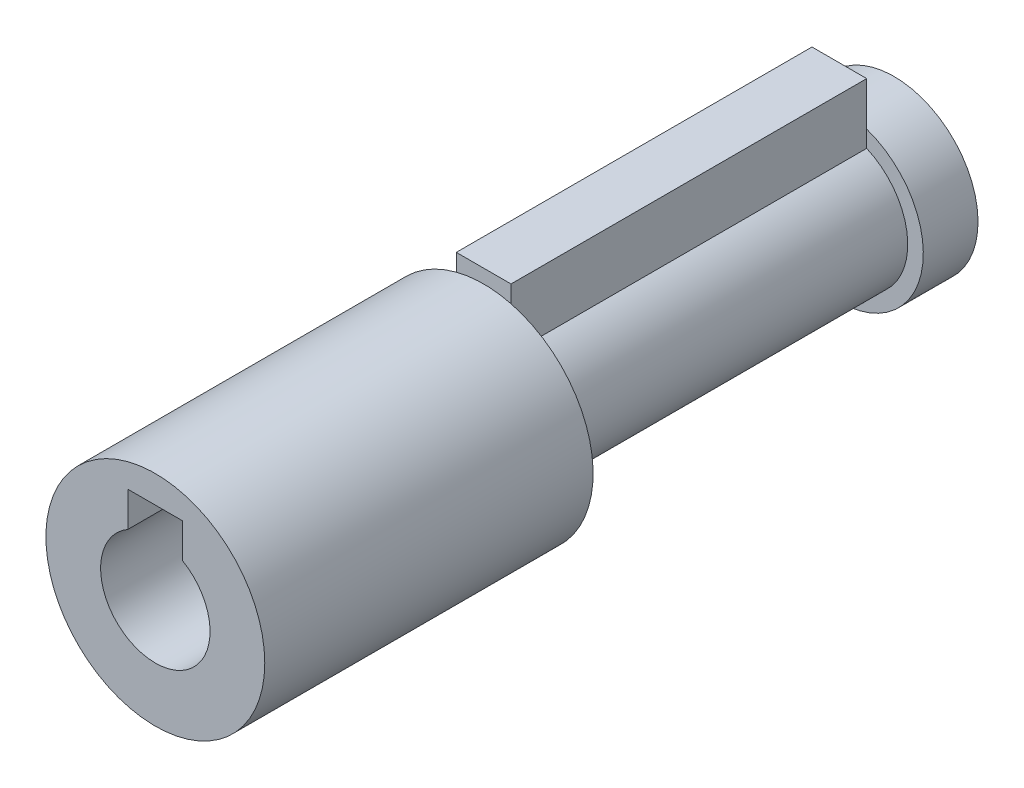
ISO-10303-21;
HEADER;
FILE_DESCRIPTION(('STEP AP214'),'2;1');
FILE_NAME('part.step','',(''),(''),'','','');
FILE_SCHEMA(('AUTOMOTIVE_DESIGN { 1 0 10303 214 1 1 1 1 }'));
ENDSEC;
DATA;
#1=APPLICATION_CONTEXT('core data for automotive mechanical design processes');
#2=APPLICATION_PROTOCOL_DEFINITION('international standard','automotive_design',2000,#1);
#3=PRODUCT_CONTEXT('',#1,'mechanical');
#4=PRODUCT('Part','Part','',(#3));
#5=PRODUCT_RELATED_PRODUCT_CATEGORY('part','',(#4));
#6=PRODUCT_DEFINITION_FORMATION('','',#4);
#7=PRODUCT_DEFINITION_CONTEXT('part definition',#1,'design');
#8=PRODUCT_DEFINITION('design','',#6,#7);
#9=PRODUCT_DEFINITION_SHAPE('','',#8);
#10=(LENGTH_UNIT() NAMED_UNIT(*) SI_UNIT(.MILLI.,.METRE.));
#11=(NAMED_UNIT(*) PLANE_ANGLE_UNIT() SI_UNIT($,.RADIAN.));
#12=(NAMED_UNIT(*) SI_UNIT($,.STERADIAN.) SOLID_ANGLE_UNIT());
#13=UNCERTAINTY_MEASURE_WITH_UNIT(LENGTH_MEASURE(1.E-05),#10,'distance_accuracy_value','');
#14=(GEOMETRIC_REPRESENTATION_CONTEXT(3) GLOBAL_UNCERTAINTY_ASSIGNED_CONTEXT((#13)) GLOBAL_UNIT_ASSIGNED_CONTEXT((#10,
#11,#12)) REPRESENTATION_CONTEXT('',''));
#15=CARTESIAN_POINT('',(0.,0.,0.));
#16=DIRECTION('',(0.,0.,1.));
#17=DIRECTION('',(1.,0.,0.));
#18=AXIS2_PLACEMENT_3D('',#15,#16,#17);
#19=CARTESIAN_POINT('',(0.,0.,12.7));
#20=DIRECTION('',(0.,0.,-1.));
#21=DIRECTION('',(-1.,0.,0.));
#22=AXIS2_PLACEMENT_3D('',#19,#20,#21);
#23=CYLINDRICAL_SURFACE('',#22,2.54);
#24=CARTESIAN_POINT('',(0.,0.,0.));
#25=DIRECTION('',(0.,0.,1.));
#26=DIRECTION('',(1.,0.,0.));
#27=AXIS2_PLACEMENT_3D('',#24,#25,#26);
#28=CIRCLE('',#27,2.54);
#29=CARTESIAN_POINT('',(-1.27,2.19970452561247,0.));
#30=VERTEX_POINT('',#29);
#31=CARTESIAN_POINT('',(1.27,2.19970452561247,0.));
#32=VERTEX_POINT('',#31);
#33=EDGE_CURVE('E181',#30,#32,#28,.T.);
#34=ORIENTED_EDGE('',*,*,#33,.F.);
#35=DIRECTION('',(0.,0.,-1.));
#36=VECTOR('',#35,1.);
#37=CARTESIAN_POINT('',(-1.27,2.19970452561247,12.7));
#38=LINE('',#37,#36);
#39=CARTESIAN_POINT('',(-1.27,2.19970452561247,12.7));
#40=VERTEX_POINT('',#39);
#41=EDGE_CURVE('E52',#40,#30,#38,.T.);
#42=ORIENTED_EDGE('',*,*,#41,.F.);
#43=CARTESIAN_POINT('',(0.,0.,12.7));
#44=DIRECTION('',(0.,0.,1.));
#45=DIRECTION('',(1.,0.,0.));
#46=AXIS2_PLACEMENT_3D('',#43,#44,#45);
#47=CIRCLE('',#46,2.54);
#48=CARTESIAN_POINT('',(1.27,2.19970452561247,12.7));
#49=VERTEX_POINT('',#48);
#50=EDGE_CURVE('E182',#40,#49,#47,.T.);
#51=ORIENTED_EDGE('',*,*,#50,.T.);
#52=DIRECTION('',(0.,0.,-1.));
#53=VECTOR('',#52,1.);
#54=CARTESIAN_POINT('',(1.27,2.19970452561247,12.7));
#55=LINE('',#54,#53);
#56=EDGE_CURVE('E196',#49,#32,#55,.T.);
#57=ORIENTED_EDGE('',*,*,#56,.T.);
#58=EDGE_LOOP('',(#34,#42,#51,#57));
#59=FACE_BOUND('',#58,.T.);
#60=ADVANCED_FACE('F49',(#59),#23,.F.);
#61=CARTESIAN_POINT('',(-1.27,0.,12.7));
#62=DIRECTION('',(1.,0.,0.));
#63=DIRECTION('',(0.,0.,-1.));
#64=AXIS2_PLACEMENT_3D('',#61,#62,#63);
#65=PLANE('',#64);
#66=DIRECTION('',(0.,-1.,0.));
#67=VECTOR('',#66,1.);
#68=CARTESIAN_POINT('',(-1.27,0.,0.));
#69=LINE('',#68,#67);
#70=CARTESIAN_POINT('',(-1.27,3.81,0.));
#71=VERTEX_POINT('',#70);
#72=EDGE_CURVE('E199',#71,#30,#69,.T.);
#73=ORIENTED_EDGE('',*,*,#72,.F.);
#74=DIRECTION('',(0.,0.,-1.));
#75=VECTOR('',#74,1.);
#76=CARTESIAN_POINT('',(-1.27,3.81,12.7));
#77=LINE('',#76,#75);
#78=CARTESIAN_POINT('',(-1.27,3.81,12.7));
#79=VERTEX_POINT('',#78);
#80=EDGE_CURVE('E209',#79,#71,#77,.T.);
#81=ORIENTED_EDGE('',*,*,#80,.F.);
#82=DIRECTION('',(0.,-1.,0.));
#83=VECTOR('',#82,1.);
#84=CARTESIAN_POINT('',(-1.27,0.,12.7));
#85=LINE('',#84,#83);
#86=EDGE_CURVE('E185',#79,#40,#85,.T.);
#87=ORIENTED_EDGE('',*,*,#86,.T.);
#88=ORIENTED_EDGE('',*,*,#41,.T.);
#89=EDGE_LOOP('',(#73,#81,#87,#88));
#90=FACE_BOUND('',#89,.T.);
#91=ADVANCED_FACE('F215',(#90),#65,.T.);
#92=CARTESIAN_POINT('',(0.,3.81,12.7));
#93=DIRECTION('',(0.,1.,0.));
#94=DIRECTION('',(-1.,0.,0.));
#95=AXIS2_PLACEMENT_3D('',#92,#93,#94);
#96=PLANE('',#95);
#97=DIRECTION('',(1.,0.,0.));
#98=VECTOR('',#97,1.);
#99=CARTESIAN_POINT('',(0.,3.81,0.));
#100=LINE('',#99,#98);
#101=CARTESIAN_POINT('',(1.27,3.81,0.));
#102=VERTEX_POINT('',#101);
#103=EDGE_CURVE('E202',#71,#102,#100,.T.);
#104=ORIENTED_EDGE('',*,*,#103,.T.);
#105=DIRECTION('',(0.,0.,-1.));
#106=VECTOR('',#105,1.);
#107=CARTESIAN_POINT('',(1.27,3.81,12.7));
#108=LINE('',#107,#106);
#109=CARTESIAN_POINT('',(1.27,3.81,12.7));
#110=VERTEX_POINT('',#109);
#111=EDGE_CURVE('E207',#110,#102,#108,.T.);
#112=ORIENTED_EDGE('',*,*,#111,.F.);
#113=DIRECTION('',(1.,0.,0.));
#114=VECTOR('',#113,1.);
#115=CARTESIAN_POINT('',(0.,3.81,12.7));
#116=LINE('',#115,#114);
#117=EDGE_CURVE('E189',#79,#110,#116,.T.);
#118=ORIENTED_EDGE('',*,*,#117,.F.);
#119=ORIENTED_EDGE('',*,*,#80,.T.);
#120=EDGE_LOOP('',(#104,#112,#118,#119));
#121=FACE_BOUND('',#120,.T.);
#122=ADVANCED_FACE('F224',(#121),#96,.F.);
#123=CARTESIAN_POINT('',(1.27,0.,12.7));
#124=DIRECTION('',(1.,0.,0.));
#125=DIRECTION('',(0.,1.,0.));
#126=AXIS2_PLACEMENT_3D('',#123,#124,#125);
#127=PLANE('',#126);
#128=DIRECTION('',(0.,-1.,0.));
#129=VECTOR('',#128,1.);
#130=CARTESIAN_POINT('',(1.27,0.,0.));
#131=LINE('',#130,#129);
#132=EDGE_CURVE('E186',#102,#32,#131,.T.);
#133=ORIENTED_EDGE('',*,*,#132,.T.);
#134=ORIENTED_EDGE('',*,*,#56,.F.);
#135=DIRECTION('',(0.,-1.,0.));
#136=VECTOR('',#135,1.);
#137=CARTESIAN_POINT('',(1.27,0.,12.7));
#138=LINE('',#137,#136);
#139=EDGE_CURVE('E191',#110,#49,#138,.T.);
#140=ORIENTED_EDGE('',*,*,#139,.F.);
#141=ORIENTED_EDGE('',*,*,#111,.T.);
#142=EDGE_LOOP('',(#133,#134,#140,#141));
#143=FACE_BOUND('',#142,.T.);
#144=ADVANCED_FACE('F227',(#143),#127,.F.);
#145=CARTESIAN_POINT('',(0.,0.,12.7));
#146=DIRECTION('',(0.,0.,-1.));
#147=DIRECTION('',(-1.,0.,0.));
#148=AXIS2_PLACEMENT_3D('',#145,#146,#147);
#149=CYLINDRICAL_SURFACE('',#148,5.08);
#150=CARTESIAN_POINT('',(0.,0.,12.7));
#151=DIRECTION('',(0.,0.,1.));
#152=DIRECTION('',(1.,0.,0.));
#153=AXIS2_PLACEMENT_3D('',#150,#151,#152);
#154=CIRCLE('',#153,5.08);
#155=CARTESIAN_POINT('',(5.08,0.,12.7));
#156=VERTEX_POINT('',#155);
#157=EDGE_CURVE('E193',#156,#156,#154,.T.);
#158=ORIENTED_EDGE('',*,*,#157,.F.);
#159=EDGE_LOOP('',(#158));
#160=FACE_BOUND('',#159,.T.);
#161=CARTESIAN_POINT('',(0.,0.,-2.54));
#162=DIRECTION('',(0.,0.,-1.));
#163=DIRECTION('',(-1.,0.,0.));
#164=AXIS2_PLACEMENT_3D('',#161,#162,#163);
#165=CIRCLE('',#164,5.08);
#166=CARTESIAN_POINT('',(-1.27,4.91868884968342,-2.54));
#167=VERTEX_POINT('',#166);
#168=CARTESIAN_POINT('',(1.27,4.91868884968342,-2.54));
#169=VERTEX_POINT('',#168);
#170=EDGE_CURVE('E178',#167,#169,#165,.T.);
#171=ORIENTED_EDGE('',*,*,#170,.F.);
#172=EDGE_CURVE('E177',#169,#167,#165,.T.);
#173=ORIENTED_EDGE('',*,*,#172,.F.);
#174=EDGE_LOOP('',(#171,#173));
#175=FACE_BOUND('',#174,.T.);
#176=ADVANCED_FACE('F244',(#160,#175),#149,.T.);
#177=CARTESIAN_POINT('',(0.,0.,12.7));
#178=DIRECTION('',(0.,0.,1.));
#179=DIRECTION('',(1.,0.,0.));
#180=AXIS2_PLACEMENT_3D('',#177,#178,#179);
#181=PLANE('',#180);
#182=ORIENTED_EDGE('',*,*,#50,.F.);
#183=ORIENTED_EDGE('',*,*,#86,.F.);
#184=ORIENTED_EDGE('',*,*,#117,.T.);
#185=ORIENTED_EDGE('',*,*,#139,.T.);
#186=EDGE_LOOP('',(#182,#183,#184,#185));
#187=FACE_BOUND('',#186,.T.);
#188=ORIENTED_EDGE('',*,*,#157,.T.);
#189=EDGE_LOOP('',(#188));
#190=FACE_BOUND('',#189,.T.);
#191=ADVANCED_FACE('F230',(#187,#190),#181,.T.);
#192=CARTESIAN_POINT('',(0.,0.,0.));
#193=DIRECTION('',(0.,0.,-1.));
#194=DIRECTION('',(-1.,0.,0.));
#195=AXIS2_PLACEMENT_3D('',#192,#193,#194);
#196=PLANE('',#195);
#197=ORIENTED_EDGE('',*,*,#72,.T.);
#198=ORIENTED_EDGE('',*,*,#33,.T.);
#199=ORIENTED_EDGE('',*,*,#132,.F.);
#200=ORIENTED_EDGE('',*,*,#103,.F.);
#201=EDGE_LOOP('',(#197,#198,#199,#200));
#202=FACE_BOUND('',#201,.T.);
#203=ADVANCED_FACE('F221',(#202),#196,.F.);
#204=CARTESIAN_POINT('',(0.,0.,-2.54));
#205=DIRECTION('',(0.,0.,-1.));
#206=DIRECTION('',(-1.,0.,0.));
#207=AXIS2_PLACEMENT_3D('',#204,#205,#206);
#208=PLANE('',#207);
#209=DIRECTION('',(0.,-1.,0.));
#210=VECTOR('',#209,1.);
#211=CARTESIAN_POINT('',(1.27,5.715,-2.54));
#212=LINE('',#211,#210);
#213=CARTESIAN_POINT('',(1.27,2.90993556629696,-2.54));
#214=VERTEX_POINT('',#213);
#215=EDGE_CURVE('E11',#169,#214,#212,.T.);
#216=ORIENTED_EDGE('',*,*,#215,.F.);
#217=ORIENTED_EDGE('',*,*,#172,.T.);
#218=DIRECTION('',(0.,1.,0.));
#219=VECTOR('',#218,1.);
#220=CARTESIAN_POINT('',(-1.27,5.715,-2.54));
#221=LINE('',#220,#219);
#222=CARTESIAN_POINT('',(-1.27,2.90993556629696,-2.54));
#223=VERTEX_POINT('',#222);
#224=EDGE_CURVE('E165',#223,#167,#221,.T.);
#225=ORIENTED_EDGE('',*,*,#224,.F.);
#226=CARTESIAN_POINT('',(0.,0.,-2.54));
#227=DIRECTION('',(0.,0.,-1.));
#228=DIRECTION('',(-1.,0.,0.));
#229=AXIS2_PLACEMENT_3D('',#226,#227,#228);
#230=CIRCLE('',#229,3.175);
#231=EDGE_CURVE('E73',#214,#223,#230,.T.);
#232=ORIENTED_EDGE('',*,*,#231,.F.);
#233=EDGE_LOOP('',(#216,#217,#225,#232));
#234=FACE_BOUND('',#233,.T.);
#235=ADVANCED_FACE('F251',(#234),#208,.T.);
#236=CARTESIAN_POINT('',(0.,0.,-2.54));
#237=DIRECTION('',(0.,0.,-1.));
#238=DIRECTION('',(-1.,0.,0.));
#239=AXIS2_PLACEMENT_3D('',#236,#237,#238);
#240=PLANE('',#239);
#241=CARTESIAN_POINT('',(-1.27,5.715,-2.54));
#242=VERTEX_POINT('',#241);
#243=EDGE_CURVE('E164',#167,#242,#221,.T.);
#244=ORIENTED_EDGE('',*,*,#243,.F.);
#245=ORIENTED_EDGE('',*,*,#170,.T.);
#246=CARTESIAN_POINT('',(1.27,5.715,-2.54));
#247=VERTEX_POINT('',#246);
#248=EDGE_CURVE('E58',#247,#169,#212,.T.);
#249=ORIENTED_EDGE('',*,*,#248,.F.);
#250=DIRECTION('',(1.,0.,0.));
#251=VECTOR('',#250,1.);
#252=CARTESIAN_POINT('',(1.27,5.715,-2.54));
#253=LINE('',#252,#251);
#254=EDGE_CURVE('E144',#242,#247,#253,.T.);
#255=ORIENTED_EDGE('',*,*,#254,.F.);
#256=EDGE_LOOP('',(#244,#245,#249,#255));
#257=FACE_BOUND('',#256,.T.);
#258=ADVANCED_FACE('F254',(#257),#240,.F.);
#259=CARTESIAN_POINT('',(1.27,5.715,-19.05));
#260=DIRECTION('',(-1.,0.,0.));
#261=DIRECTION('',(0.,-1.,0.));
#262=AXIS2_PLACEMENT_3D('',#259,#260,#261);
#263=PLANE('',#262);
#264=ORIENTED_EDGE('',*,*,#248,.T.);
#265=ORIENTED_EDGE('',*,*,#215,.T.);
#266=DIRECTION('',(0.,0.,1.));
#267=VECTOR('',#266,1.);
#268=CARTESIAN_POINT('',(1.27,2.90993556629696,-19.05));
#269=LINE('',#268,#267);
#270=CARTESIAN_POINT('',(1.27,2.90993556629696,-19.05));
#271=VERTEX_POINT('',#270);
#272=EDGE_CURVE('E141',#271,#214,#269,.T.);
#273=ORIENTED_EDGE('',*,*,#272,.F.);
#274=DIRECTION('',(0.,-1.,0.));
#275=VECTOR('',#274,1.);
#276=CARTESIAN_POINT('',(1.27,5.715,-19.05));
#277=LINE('',#276,#275);
#278=CARTESIAN_POINT('',(1.27,3.68440227894967,-19.05));
#279=VERTEX_POINT('',#278);
#280=EDGE_CURVE('E133',#279,#271,#277,.T.);
#281=ORIENTED_EDGE('',*,*,#280,.F.);
#282=CARTESIAN_POINT('',(1.27,5.715,-19.05));
#283=VERTEX_POINT('',#282);
#284=EDGE_CURVE('E124',#283,#279,#277,.T.);
#285=ORIENTED_EDGE('',*,*,#284,.F.);
#286=DIRECTION('',(0.,0.,1.));
#287=VECTOR('',#286,1.);
#288=CARTESIAN_POINT('',(1.27,5.715,-19.05));
#289=LINE('',#288,#287);
#290=EDGE_CURVE('E161',#283,#247,#289,.T.);
#291=ORIENTED_EDGE('',*,*,#290,.T.);
#292=EDGE_LOOP('',(#264,#265,#273,#281,#285,#291));
#293=FACE_BOUND('',#292,.T.);
#294=ADVANCED_FACE('F139',(#293),#263,.F.);
#295=CARTESIAN_POINT('',(0.,0.,-19.05));
#296=DIRECTION('',(0.,0.,1.));
#297=DIRECTION('',(1.,0.,0.));
#298=AXIS2_PLACEMENT_3D('',#295,#296,#297);
#299=CYLINDRICAL_SURFACE('',#298,3.175);
#300=ORIENTED_EDGE('',*,*,#231,.T.);
#301=DIRECTION('',(0.,0.,1.));
#302=VECTOR('',#301,1.);
#303=CARTESIAN_POINT('',(-1.27,2.90993556629696,-19.05));
#304=LINE('',#303,#302);
#305=CARTESIAN_POINT('',(-1.27,2.90993556629696,-19.05));
#306=VERTEX_POINT('',#305);
#307=EDGE_CURVE('E173',#306,#223,#304,.T.);
#308=ORIENTED_EDGE('',*,*,#307,.F.);
#309=CARTESIAN_POINT('',(0.,0.,-19.05));
#310=DIRECTION('',(0.,0.,-1.));
#311=DIRECTION('',(-1.,0.,0.));
#312=AXIS2_PLACEMENT_3D('',#309,#310,#311);
#313=CIRCLE('',#312,3.175);
#314=EDGE_CURVE('E132',#271,#306,#313,.T.);
#315=ORIENTED_EDGE('',*,*,#314,.F.);
#316=ORIENTED_EDGE('',*,*,#272,.T.);
#317=EDGE_LOOP('',(#300,#308,#315,#316));
#318=FACE_BOUND('',#317,.T.);
#319=ADVANCED_FACE('F257',(#318),#299,.T.);
#320=CARTESIAN_POINT('',(-1.27,5.715,-19.05));
#321=DIRECTION('',(1.,0.,0.));
#322=DIRECTION('',(0.,1.,0.));
#323=AXIS2_PLACEMENT_3D('',#320,#321,#322);
#324=PLANE('',#323);
#325=ORIENTED_EDGE('',*,*,#224,.T.);
#326=ORIENTED_EDGE('',*,*,#243,.T.);
#327=DIRECTION('',(0.,0.,1.));
#328=VECTOR('',#327,1.);
#329=CARTESIAN_POINT('',(-1.27,5.715,-19.05));
#330=LINE('',#329,#328);
#331=CARTESIAN_POINT('',(-1.27,5.715,-19.05));
#332=VERTEX_POINT('',#331);
#333=EDGE_CURVE('E170',#332,#242,#330,.T.);
#334=ORIENTED_EDGE('',*,*,#333,.F.);
#335=DIRECTION('',(0.,1.,0.));
#336=VECTOR('',#335,1.);
#337=CARTESIAN_POINT('',(-1.27,5.715,-19.05));
#338=LINE('',#337,#336);
#339=CARTESIAN_POINT('',(-1.27,3.68440227894967,-19.05));
#340=VERTEX_POINT('',#339);
#341=EDGE_CURVE('E159',#340,#332,#338,.T.);
#342=ORIENTED_EDGE('',*,*,#341,.F.);
#343=EDGE_CURVE('E150',#306,#340,#338,.T.);
#344=ORIENTED_EDGE('',*,*,#343,.F.);
#345=ORIENTED_EDGE('',*,*,#307,.T.);
#346=EDGE_LOOP('',(#325,#326,#334,#342,#344,#345));
#347=FACE_BOUND('',#346,.T.);
#348=ADVANCED_FACE('F260',(#347),#324,.F.);
#349=CARTESIAN_POINT('',(1.27,5.715,-19.05));
#350=DIRECTION('',(0.,-1.,0.));
#351=DIRECTION('',(0.,0.,-1.));
#352=AXIS2_PLACEMENT_3D('',#349,#350,#351);
#353=PLANE('',#352);
#354=ORIENTED_EDGE('',*,*,#254,.T.);
#355=ORIENTED_EDGE('',*,*,#290,.F.);
#356=DIRECTION('',(1.,0.,0.));
#357=VECTOR('',#356,1.);
#358=CARTESIAN_POINT('',(1.27,5.715,-19.05));
#359=LINE('',#358,#357);
#360=EDGE_CURVE('E128',#332,#283,#359,.T.);
#361=ORIENTED_EDGE('',*,*,#360,.F.);
#362=ORIENTED_EDGE('',*,*,#333,.T.);
#363=EDGE_LOOP('',(#354,#355,#361,#362));
#364=FACE_BOUND('',#363,.T.);
#365=ADVANCED_FACE('F264',(#364),#353,.F.);
#366=CARTESIAN_POINT('',(0.,0.,-19.05));
#367=DIRECTION('',(0.,0.,-1.));
#368=DIRECTION('',(-1.,0.,0.));
#369=AXIS2_PLACEMENT_3D('',#366,#367,#368);
#370=PLANE('',#369);
#371=CARTESIAN_POINT('',(0.,0.,-19.05));
#372=DIRECTION('',(0.,0.,-1.));
#373=DIRECTION('',(-1.,0.,0.));
#374=AXIS2_PLACEMENT_3D('',#371,#372,#373);
#375=CIRCLE('',#374,3.8971425625873);
#376=EDGE_CURVE('E65',#340,#279,#375,.T.);
#377=ORIENTED_EDGE('',*,*,#376,.F.);
#378=ORIENTED_EDGE('',*,*,#341,.T.);
#379=ORIENTED_EDGE('',*,*,#360,.T.);
#380=ORIENTED_EDGE('',*,*,#284,.T.);
#381=EDGE_LOOP('',(#377,#378,#379,#380));
#382=FACE_BOUND('',#381,.T.);
#383=ADVANCED_FACE('F126',(#382),#370,.T.);
#384=CARTESIAN_POINT('',(0.,0.,-19.05));
#385=DIRECTION('',(0.,0.,-1.));
#386=DIRECTION('',(-1.,0.,0.));
#387=AXIS2_PLACEMENT_3D('',#384,#385,#386);
#388=PLANE('',#387);
#389=EDGE_CURVE('E147',#279,#340,#375,.T.);
#390=ORIENTED_EDGE('',*,*,#389,.F.);
#391=ORIENTED_EDGE('',*,*,#280,.T.);
#392=ORIENTED_EDGE('',*,*,#314,.T.);
#393=ORIENTED_EDGE('',*,*,#343,.T.);
#394=EDGE_LOOP('',(#390,#391,#392,#393));
#395=FACE_BOUND('',#394,.T.);
#396=ADVANCED_FACE('F148',(#395),#388,.F.);
#397=CARTESIAN_POINT('',(0.,0.,-21.59));
#398=DIRECTION('',(0.,0.,1.));
#399=DIRECTION('',(1.,0.,0.));
#400=AXIS2_PLACEMENT_3D('',#397,#398,#399);
#401=CYLINDRICAL_SURFACE('',#400,3.8971425625873);
#402=CARTESIAN_POINT('',(0.,0.,-21.59));
#403=DIRECTION('',(0.,0.,-1.));
#404=DIRECTION('',(-1.,0.,0.));
#405=AXIS2_PLACEMENT_3D('',#402,#403,#404);
#406=CIRCLE('',#405,3.8971425625873);
#407=CARTESIAN_POINT('',(-3.8971425625873,0.,-21.59));
#408=VERTEX_POINT('',#407);
#409=EDGE_CURVE('E154',#408,#408,#406,.T.);
#410=ORIENTED_EDGE('',*,*,#409,.F.);
#411=EDGE_LOOP('',(#410));
#412=FACE_BOUND('',#411,.T.);
#413=ORIENTED_EDGE('',*,*,#376,.T.);
#414=ORIENTED_EDGE('',*,*,#389,.T.);
#415=EDGE_LOOP('',(#413,#414));
#416=FACE_BOUND('',#415,.T.);
#417=ADVANCED_FACE('F153',(#412,#416),#401,.T.);
#418=CARTESIAN_POINT('',(0.,0.,-21.59));
#419=DIRECTION('',(0.,0.,-1.));
#420=DIRECTION('',(-1.,0.,0.));
#421=AXIS2_PLACEMENT_3D('',#418,#419,#420);
#422=PLANE('',#421);
#423=ORIENTED_EDGE('',*,*,#409,.T.);
#424=EDGE_LOOP('',(#423));
#425=FACE_BOUND('',#424,.T.);
#426=ADVANCED_FACE('F276',(#425),#422,.T.);
#427=CLOSED_SHELL('',(#60,#91,#122,#144,#176,#191,#203,#235,#258,#294,#319,#348,#365,#383,#396,
#417,#426));
#428=MANIFOLD_SOLID_BREP('B2',#427);
#429=ADVANCED_BREP_SHAPE_REPRESENTATION('',(#18,#428),#14);
#430=SHAPE_DEFINITION_REPRESENTATION(#9,#429);
ENDSEC;
END-ISO-10303-21;
